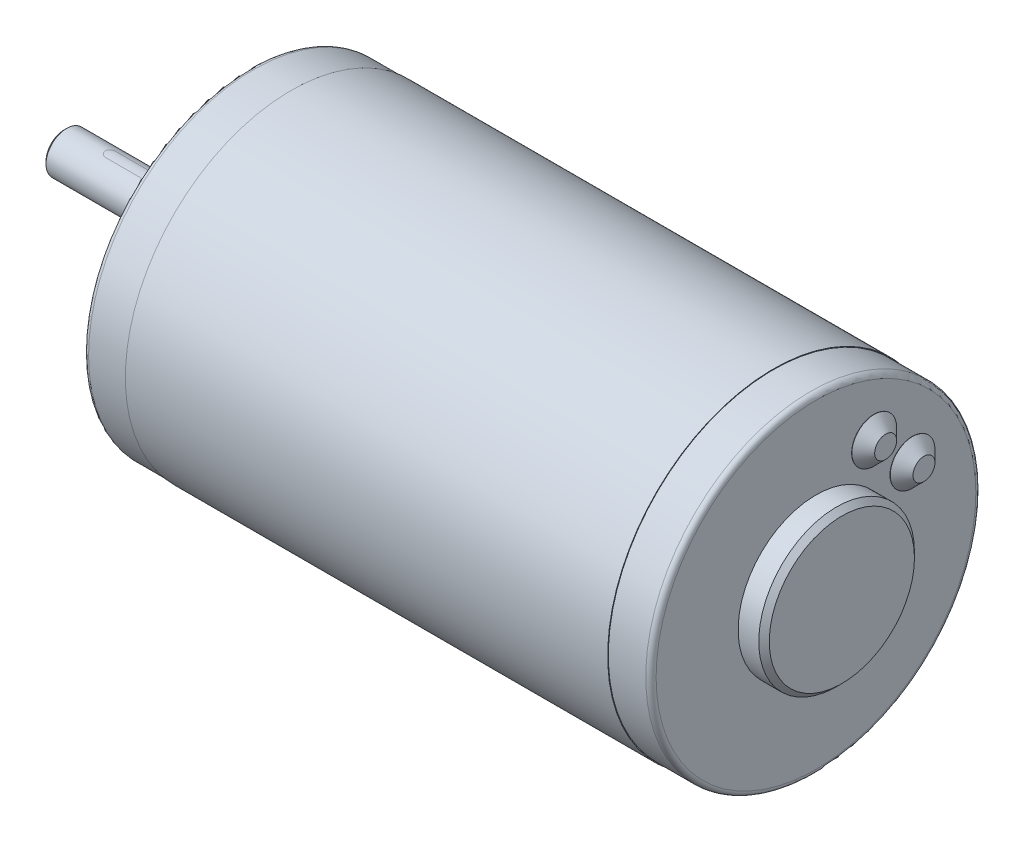
ISO-10303-21;
HEADER;
FILE_DESCRIPTION(('STEP AP214'),'2;1');
FILE_NAME('part.step','',(''),(''),'','','');
FILE_SCHEMA(('AUTOMOTIVE_DESIGN { 1 0 10303 214 1 1 1 1 }'));
ENDSEC;
DATA;
#1=APPLICATION_CONTEXT('core data for automotive mechanical design processes');
#2=APPLICATION_PROTOCOL_DEFINITION('international standard','automotive_design',2000,#1);
#3=PRODUCT_CONTEXT('',#1,'mechanical');
#4=PRODUCT('Part','Part','',(#3));
#5=PRODUCT_RELATED_PRODUCT_CATEGORY('part','',(#4));
#6=PRODUCT_DEFINITION_FORMATION('','',#4);
#7=PRODUCT_DEFINITION_CONTEXT('part definition',#1,'design');
#8=PRODUCT_DEFINITION('design','',#6,#7);
#9=PRODUCT_DEFINITION_SHAPE('','',#8);
#10=(LENGTH_UNIT() NAMED_UNIT(*) SI_UNIT(.MILLI.,.METRE.));
#11=(NAMED_UNIT(*) PLANE_ANGLE_UNIT() SI_UNIT($,.RADIAN.));
#12=(NAMED_UNIT(*) SI_UNIT($,.STERADIAN.) SOLID_ANGLE_UNIT());
#13=UNCERTAINTY_MEASURE_WITH_UNIT(LENGTH_MEASURE(1.E-05),#10,'distance_accuracy_value','');
#14=(GEOMETRIC_REPRESENTATION_CONTEXT(3) GLOBAL_UNCERTAINTY_ASSIGNED_CONTEXT((#13)) GLOBAL_UNIT_ASSIGNED_CONTEXT((#10,
#11,#12)) REPRESENTATION_CONTEXT('',''));
#15=CARTESIAN_POINT('',(0.,0.,0.));
#16=DIRECTION('',(0.,0.,1.));
#17=DIRECTION('',(1.,0.,0.));
#18=AXIS2_PLACEMENT_3D('',#15,#16,#17);
#19=CARTESIAN_POINT('',(-3.999992,0.,0.));
#20=DIRECTION('',(-1.,0.,0.));
#21=DIRECTION('',(0.,0.,1.));
#22=AXIS2_PLACEMENT_3D('',#19,#20,#21);
#23=PLANE('',#22);
#24=CARTESIAN_POINT('',(-3.999992,0.,0.));
#25=DIRECTION('',(-1.,0.,0.));
#26=DIRECTION('',(0.,0.,1.));
#27=AXIS2_PLACEMENT_3D('',#24,#25,#26);
#28=CIRCLE('',#27,8.50899999999999);
#29=CARTESIAN_POINT('',(-3.999992,0.,8.50899999999999));
#30=VERTEX_POINT('',#29);
#31=EDGE_CURVE('P0_E228',#30,#30,#28,.T.);
#32=ORIENTED_EDGE('',*,*,#31,.T.);
#33=EDGE_LOOP('',(#32));
#34=FACE_BOUND('',#33,.T.);
#35=CARTESIAN_POINT('',(-3.999992,0.,0.));
#36=DIRECTION('',(-1.,0.,0.));
#37=DIRECTION('',(0.,0.,1.));
#38=AXIS2_PLACEMENT_3D('',#35,#36,#37);
#39=CIRCLE('',#38,4.);
#40=CARTESIAN_POINT('',(-3.999992,0.,4.));
#41=VERTEX_POINT('',#40);
#42=EDGE_CURVE('P0_E137',#41,#41,#39,.T.);
#43=ORIENTED_EDGE('',*,*,#42,.F.);
#44=EDGE_LOOP('',(#43));
#45=FACE_BOUND('',#44,.T.);
#46=ADVANCED_FACE('P0_F42',(#34,#45),#23,.T.);
#47=CARTESIAN_POINT('',(0.,0.,0.));
#48=DIRECTION('',(-1.,0.,0.));
#49=DIRECTION('',(0.,0.,1.));
#50=AXIS2_PLACEMENT_3D('',#47,#48,#49);
#51=PLANE('',#50);
#52=CARTESIAN_POINT('',(0.,0.,0.));
#53=DIRECTION('',(-1.,0.,0.));
#54=DIRECTION('',(0.,0.,1.));
#55=AXIS2_PLACEMENT_3D('',#52,#53,#54);
#56=CIRCLE('',#55,30.877);
#57=CARTESIAN_POINT('',(0.,0.,30.877));
#58=VERTEX_POINT('',#57);
#59=EDGE_CURVE('P0_E51',#58,#58,#56,.T.);
#60=ORIENTED_EDGE('',*,*,#59,.T.);
#61=EDGE_LOOP('',(#60));
#62=FACE_BOUND('',#61,.T.);
#63=CARTESIAN_POINT('',(0.,25.4,0.));
#64=DIRECTION('',(-1.,0.,0.));
#65=DIRECTION('',(0.,0.,1.));
#66=AXIS2_PLACEMENT_3D('',#63,#64,#65);
#67=CIRCLE('',#66,2.01929999999999);
#68=CARTESIAN_POINT('',(0.,25.4,2.01929999999999));
#69=VERTEX_POINT('',#68);
#70=EDGE_CURVE('P0_E101',#69,#69,#67,.T.);
#71=ORIENTED_EDGE('',*,*,#70,.F.);
#72=EDGE_LOOP('',(#71));
#73=FACE_BOUND('',#72,.T.);
#74=CARTESIAN_POINT('',(0.,-25.4,0.));
#75=DIRECTION('',(-1.,0.,0.));
#76=DIRECTION('',(0.,0.,1.));
#77=AXIS2_PLACEMENT_3D('',#74,#75,#76);
#78=CIRCLE('',#77,2.01929999999999);
#79=CARTESIAN_POINT('',(0.,-25.4,2.01929999999999));
#80=VERTEX_POINT('',#79);
#81=EDGE_CURVE('P0_E100',#80,#80,#78,.T.);
#82=ORIENTED_EDGE('',*,*,#81,.F.);
#83=EDGE_LOOP('',(#82));
#84=FACE_BOUND('',#83,.T.);
#85=CARTESIAN_POINT('',(0.,0.,0.));
#86=DIRECTION('',(-1.,0.,0.));
#87=DIRECTION('',(0.,0.,1.));
#88=AXIS2_PLACEMENT_3D('',#85,#86,#87);
#89=CIRCLE('',#88,9.525);
#90=CARTESIAN_POINT('',(0.,0.,9.525));
#91=VERTEX_POINT('',#90);
#92=EDGE_CURVE('P0_E189',#91,#91,#89,.T.);
#93=ORIENTED_EDGE('',*,*,#92,.F.);
#94=EDGE_LOOP('',(#93));
#95=FACE_BOUND('',#94,.T.);
#96=ADVANCED_FACE('P0_F254',(#62,#73,#84,#95),#51,.T.);
#97=CARTESIAN_POINT('',(8.2296,32.004,0.));
#98=DIRECTION('',(-1.,0.,0.));
#99=DIRECTION('',(0.,0.,1.));
#100=AXIS2_PLACEMENT_3D('',#97,#98,#99);
#101=PLANE('',#100);
#102=CARTESIAN_POINT('',(8.2296,0.,0.));
#103=DIRECTION('',(1.,0.,0.));
#104=DIRECTION('',(0.,0.,-1.));
#105=AXIS2_PLACEMENT_3D('',#102,#103,#104);
#106=CIRCLE('',#105,32.004);
#107=CARTESIAN_POINT('',(8.2296,0.,-32.004));
#108=VERTEX_POINT('',#107);
#109=EDGE_CURVE('P0_E217',#108,#108,#106,.T.);
#110=ORIENTED_EDGE('',*,*,#109,.F.);
#111=EDGE_LOOP('',(#110));
#112=FACE_BOUND('',#111,.T.);
#113=CARTESIAN_POINT('',(8.2296,0.,0.));
#114=DIRECTION('',(-1.,0.,0.));
#115=DIRECTION('',(0.,0.,1.));
#116=AXIS2_PLACEMENT_3D('',#113,#114,#115);
#117=CIRCLE('',#116,31.877);
#118=CARTESIAN_POINT('',(8.2296,0.,31.877));
#119=VERTEX_POINT('',#118);
#120=EDGE_CURVE('P0_E193',#119,#119,#117,.T.);
#121=ORIENTED_EDGE('',*,*,#120,.F.);
#122=EDGE_LOOP('',(#121));
#123=FACE_BOUND('',#122,.T.);
#124=ADVANCED_FACE('P0_F272',(#112,#123),#101,.T.);
#125=CARTESIAN_POINT('',(109.6,0.,0.));
#126=DIRECTION('',(1.,0.,0.));
#127=DIRECTION('',(0.,0.,-1.));
#128=AXIS2_PLACEMENT_3D('',#125,#126,#127);
#129=PLANE('',#128);
#130=CARTESIAN_POINT('',(109.6,0.,0.));
#131=DIRECTION('',(1.,0.,0.));
#132=DIRECTION('',(0.,0.,-1.));
#133=AXIS2_PLACEMENT_3D('',#130,#131,#132);
#134=CIRCLE('',#133,30.877);
#135=CARTESIAN_POINT('',(109.6,0.,-30.877));
#136=VERTEX_POINT('',#135);
#137=EDGE_CURVE('P0_E243',#136,#136,#134,.T.);
#138=ORIENTED_EDGE('',*,*,#137,.T.);
#139=EDGE_LOOP('',(#138));
#140=FACE_BOUND('',#139,.T.);
#141=CARTESIAN_POINT('',(109.6,18.6070906828553,-11.2073596390943));
#142=DIRECTION('',(1.,0.,0.));
#143=DIRECTION('',(0.,0.,-1.));
#144=AXIS2_PLACEMENT_3D('',#141,#142,#143);
#145=CIRCLE('',#144,4.318);
#146=CARTESIAN_POINT('',(109.6,18.6070906828553,-15.5253596390943));
#147=VERTEX_POINT('',#146);
#148=EDGE_CURVE('P0_E225',#147,#147,#145,.T.);
#149=ORIENTED_EDGE('',*,*,#148,.F.);
#150=EDGE_LOOP('',(#149));
#151=FACE_BOUND('',#150,.T.);
#152=CARTESIAN_POINT('',(109.6,11.2073596390943,-18.6070906828553));
#153=DIRECTION('',(1.,0.,0.));
#154=DIRECTION('',(0.,0.,-1.));
#155=AXIS2_PLACEMENT_3D('',#152,#153,#154);
#156=CIRCLE('',#155,4.318);
#157=CARTESIAN_POINT('',(109.6,11.2073596390943,-22.9250906828553));
#158=VERTEX_POINT('',#157);
#159=EDGE_CURVE('P0_E221',#158,#158,#156,.T.);
#160=ORIENTED_EDGE('',*,*,#159,.F.);
#161=EDGE_LOOP('',(#160));
#162=FACE_BOUND('',#161,.T.);
#163=CARTESIAN_POINT('',(109.6,0.,0.));
#164=DIRECTION('',(1.,0.,0.));
#165=DIRECTION('',(0.,0.,-1.));
#166=AXIS2_PLACEMENT_3D('',#163,#164,#165);
#167=CIRCLE('',#166,15.0368);
#168=CARTESIAN_POINT('',(109.6,0.,-15.0368));
#169=VERTEX_POINT('',#168);
#170=EDGE_CURVE('P0_E201',#169,#169,#167,.T.);
#171=ORIENTED_EDGE('',*,*,#170,.F.);
#172=EDGE_LOOP('',(#171));
#173=FACE_BOUND('',#172,.T.);
#174=ADVANCED_FACE('P0_F300',(#140,#151,#162,#173),#129,.T.);
#175=CARTESIAN_POINT('',(101.3704,0.,0.));
#176=DIRECTION('',(1.,0.,0.));
#177=DIRECTION('',(0.,0.,-1.));
#178=AXIS2_PLACEMENT_3D('',#175,#176,#177);
#179=PLANE('',#178);
#180=CARTESIAN_POINT('',(101.3704,0.,0.));
#181=DIRECTION('',(1.,0.,0.));
#182=DIRECTION('',(0.,0.,-1.));
#183=AXIS2_PLACEMENT_3D('',#180,#181,#182);
#184=CIRCLE('',#183,32.004);
#185=CARTESIAN_POINT('',(101.3704,0.,-32.004));
#186=VERTEX_POINT('',#185);
#187=EDGE_CURVE('P0_E213',#186,#186,#184,.T.);
#188=ORIENTED_EDGE('',*,*,#187,.T.);
#189=EDGE_LOOP('',(#188));
#190=FACE_BOUND('',#189,.T.);
#191=CARTESIAN_POINT('',(101.3704,0.,0.));
#192=DIRECTION('',(1.,0.,0.));
#193=DIRECTION('',(0.,0.,-1.));
#194=AXIS2_PLACEMENT_3D('',#191,#192,#193);
#195=CIRCLE('',#194,31.877);
#196=CARTESIAN_POINT('',(101.3704,0.,-31.877));
#197=VERTEX_POINT('',#196);
#198=EDGE_CURVE('P0_E206',#197,#197,#195,.T.);
#199=ORIENTED_EDGE('',*,*,#198,.F.);
#200=EDGE_LOOP('',(#199));
#201=FACE_BOUND('',#200,.T.);
#202=ADVANCED_FACE('P0_F303',(#190,#201),#179,.T.);
#203=CARTESIAN_POINT('',(8.2296,0.,0.));
#204=DIRECTION('',(1.,0.,0.));
#205=DIRECTION('',(0.,0.,-1.));
#206=AXIS2_PLACEMENT_3D('',#203,#204,#205);
#207=CYLINDRICAL_SURFACE('',#206,32.004);
#208=ORIENTED_EDGE('',*,*,#109,.T.);
#209=EDGE_LOOP('',(#208));
#210=FACE_BOUND('',#209,.T.);
#211=ORIENTED_EDGE('',*,*,#187,.F.);
#212=EDGE_LOOP('',(#211));
#213=FACE_BOUND('',#212,.T.);
#214=ADVANCED_FACE('P0_F307',(#210,#213),#207,.T.);
#215=CARTESIAN_POINT('',(109.6,0.,0.));
#216=DIRECTION('',(-1.,0.,0.));
#217=DIRECTION('',(0.,0.,1.));
#218=AXIS2_PLACEMENT_3D('',#215,#216,#217);
#219=CYLINDRICAL_SURFACE('',#218,31.877);
#220=CARTESIAN_POINT('',(108.6,0.,0.));
#221=DIRECTION('',(1.,0.,0.));
#222=DIRECTION('',(0.,0.,-1.));
#223=AXIS2_PLACEMENT_3D('',#220,#221,#222);
#224=CIRCLE('',#223,31.877);
#225=CARTESIAN_POINT('',(108.6,0.,-31.877));
#226=VERTEX_POINT('',#225);
#227=EDGE_CURVE('P0_E247',#226,#226,#224,.F.);
#228=ORIENTED_EDGE('',*,*,#227,.T.);
#229=EDGE_LOOP('',(#228));
#230=FACE_BOUND('',#229,.T.);
#231=ORIENTED_EDGE('',*,*,#198,.T.);
#232=EDGE_LOOP('',(#231));
#233=FACE_BOUND('',#232,.T.);
#234=ADVANCED_FACE('P0_F298',(#230,#233),#219,.T.);
#235=CARTESIAN_POINT('',(113.584,0.,0.));
#236=DIRECTION('',(-1.,0.,0.));
#237=DIRECTION('',(0.,0.,1.));
#238=AXIS2_PLACEMENT_3D('',#235,#236,#237);
#239=CYLINDRICAL_SURFACE('',#238,15.0368);
#240=CARTESIAN_POINT('',(113.584,0.,0.));
#241=DIRECTION('',(1.,0.,0.));
#242=DIRECTION('',(0.,0.,-1.));
#243=AXIS2_PLACEMENT_3D('',#240,#241,#242);
#244=CIRCLE('',#243,15.0368);
#245=CARTESIAN_POINT('',(113.584,0.,-15.0368));
#246=VERTEX_POINT('',#245);
#247=EDGE_CURVE('P0_E202',#246,#246,#244,.T.);
#248=ORIENTED_EDGE('',*,*,#247,.F.);
#249=EDGE_LOOP('',(#248));
#250=FACE_BOUND('',#249,.T.);
#251=ORIENTED_EDGE('',*,*,#170,.T.);
#252=EDGE_LOOP('',(#251));
#253=FACE_BOUND('',#252,.T.);
#254=ADVANCED_FACE('P0_F294',(#250,#253),#239,.T.);
#255=CARTESIAN_POINT('',(113.584,0.,0.));
#256=DIRECTION('',(-1.,0.,0.));
#257=DIRECTION('',(0.,0.,-1.));
#258=AXIS2_PLACEMENT_3D('',#255,#256,#257);
#259=CONICAL_SURFACE('',#258,15.0368,0.785398163397437);
#260=CARTESIAN_POINT('',(114.6,0.,0.));
#261=DIRECTION('',(1.,0.,0.));
#262=DIRECTION('',(0.,0.,-1.));
#263=AXIS2_PLACEMENT_3D('',#260,#261,#262);
#264=CIRCLE('',#263,14.0208);
#265=CARTESIAN_POINT('',(114.6,0.,-14.0208));
#266=VERTEX_POINT('',#265);
#267=EDGE_CURVE('P0_E197',#266,#266,#264,.T.);
#268=ORIENTED_EDGE('',*,*,#267,.F.);
#269=EDGE_LOOP('',(#268));
#270=FACE_BOUND('',#269,.T.);
#271=ORIENTED_EDGE('',*,*,#247,.T.);
#272=EDGE_LOOP('',(#271));
#273=FACE_BOUND('',#272,.T.);
#274=ADVANCED_FACE('P0_F290',(#270,#273),#259,.T.);
#275=CARTESIAN_POINT('',(114.6,0.,0.));
#276=DIRECTION('',(1.,0.,0.));
#277=DIRECTION('',(0.,0.,-1.));
#278=AXIS2_PLACEMENT_3D('',#275,#276,#277);
#279=PLANE('',#278);
#280=ORIENTED_EDGE('',*,*,#267,.T.);
#281=EDGE_LOOP('',(#280));
#282=FACE_BOUND('',#281,.T.);
#283=ADVANCED_FACE('P0_F286',(#282),#279,.T.);
#284=CARTESIAN_POINT('',(0.,0.,0.));
#285=DIRECTION('',(1.,0.,0.));
#286=DIRECTION('',(0.,0.,-1.));
#287=AXIS2_PLACEMENT_3D('',#284,#285,#286);
#288=CYLINDRICAL_SURFACE('',#287,31.877);
#289=CARTESIAN_POINT('',(0.999999999999998,0.,0.));
#290=DIRECTION('',(-1.,0.,0.));
#291=DIRECTION('',(0.,0.,1.));
#292=AXIS2_PLACEMENT_3D('',#289,#290,#291);
#293=CIRCLE('',#292,31.877);
#294=CARTESIAN_POINT('',(0.999999999999998,0.,31.877));
#295=VERTEX_POINT('',#294);
#296=EDGE_CURVE('P0_E11',#295,#295,#293,.F.);
#297=ORIENTED_EDGE('',*,*,#296,.T.);
#298=EDGE_LOOP('',(#297));
#299=FACE_BOUND('',#298,.T.);
#300=ORIENTED_EDGE('',*,*,#120,.T.);
#301=EDGE_LOOP('',(#300));
#302=FACE_BOUND('',#301,.T.);
#303=ADVANCED_FACE('P0_F281',(#299,#302),#288,.T.);
#304=CARTESIAN_POINT('',(-3.999992,0.,0.));
#305=DIRECTION('',(1.,0.,0.));
#306=DIRECTION('',(0.,0.,-1.));
#307=AXIS2_PLACEMENT_3D('',#304,#305,#306);
#308=CYLINDRICAL_SURFACE('',#307,9.525);
#309=CARTESIAN_POINT('',(-2.983992,0.,0.));
#310=DIRECTION('',(-1.,0.,0.));
#311=DIRECTION('',(0.,0.,1.));
#312=AXIS2_PLACEMENT_3D('',#309,#310,#311);
#313=CIRCLE('',#312,9.525);
#314=CARTESIAN_POINT('',(-2.983992,0.,9.525));
#315=VERTEX_POINT('',#314);
#316=EDGE_CURVE('P0_E232',#315,#315,#313,.F.);
#317=ORIENTED_EDGE('',*,*,#316,.T.);
#318=EDGE_LOOP('',(#317));
#319=FACE_BOUND('',#318,.T.);
#320=ORIENTED_EDGE('',*,*,#92,.T.);
#321=EDGE_LOOP('',(#320));
#322=FACE_BOUND('',#321,.T.);
#323=ADVANCED_FACE('P0_F279',(#319,#322),#308,.T.);
#324=CARTESIAN_POINT('',(-35.599992,0.,0.));
#325=DIRECTION('',(1.,0.,0.));
#326=DIRECTION('',(0.,0.,-1.));
#327=AXIS2_PLACEMENT_3D('',#324,#325,#326);
#328=CYLINDRICAL_SURFACE('',#327,4.);
#329=CARTESIAN_POINT('',(-35.099991999993,0.,0.));
#330=DIRECTION('',(-1.,0.,0.));
#331=DIRECTION('',(0.,0.,1.));
#332=AXIS2_PLACEMENT_3D('',#329,#330,#331);
#333=CIRCLE('',#332,4.);
#334=CARTESIAN_POINT('',(-35.099991999993,0.,4.));
#335=VERTEX_POINT('',#334);
#336=EDGE_CURVE('P0_E239',#335,#335,#333,.F.);
#337=ORIENTED_EDGE('',*,*,#336,.T.);
#338=EDGE_LOOP('',(#337));
#339=FACE_BOUND('',#338,.T.);
#340=DIRECTION('',(1.,0.,0.));
#341=VECTOR('',#340,1.);
#342=CARTESIAN_POINT('',(0.,3.87298334620741,-1.));
#343=LINE('',#342,#341);
#344=CARTESIAN_POINT('',(-26.6,3.87298334620741,-1.));
#345=VERTEX_POINT('',#344);
#346=CARTESIAN_POINT('',(-7.1,3.87298334620741,-1.));
#347=VERTEX_POINT('',#346);
#348=EDGE_CURVE('P0_E159',#345,#347,#343,.T.);
#349=ORIENTED_EDGE('',*,*,#348,.T.);
#350=CARTESIAN_POINT('',(-7.1,3.87298334620741,-1.));
#351=CARTESIAN_POINT('',(-7.07233701489346,3.87298148580177,-1.00000033749611));
#352=CARTESIAN_POINT('',(-7.04468773698177,3.8732800994947,-0.998851407375366));
#353=CARTESIAN_POINT('',(-6.98959596469644,3.87445904774558,-0.994271295395754));
#354=CARTESIAN_POINT('',(-6.96215343631291,3.87533928441687,-0.990840497572679));
#355=CARTESIAN_POINT('',(-6.88054682679116,3.87881710972053,-0.977175239382526));
#356=CARTESIAN_POINT('',(-6.82694353151779,3.88225203148808,-0.963567695172493));
#357=CARTESIAN_POINT('',(-6.72287532621804,3.89095422588002,-0.927798076247997));
#358=CARTESIAN_POINT('',(-6.67241012178714,3.89622132630929,-0.905636805423836));
#359=CARTESIAN_POINT('',(-6.57588855135267,3.90799134471939,-0.853415378025865));
#360=CARTESIAN_POINT('',(-6.52983337210904,3.91449459395647,-0.823353103356933));
#361=CARTESIAN_POINT('',(-6.4424561180939,3.92816262398025,-0.755484471828069));
#362=CARTESIAN_POINT('',(-6.40124511375448,3.93533791028915,-0.717537268783976));
#363=CARTESIAN_POINT('',(-6.32569791051729,3.94945104396193,-0.63527578051623));
#364=CARTESIAN_POINT('',(-6.29136281053206,3.95638885322537,-0.590960479478831));
#365=CARTESIAN_POINT('',(-6.23008899838136,3.96936182283248,-0.496456899401691));
#366=CARTESIAN_POINT('',(-6.20326010401603,3.9753830468173,-0.446195340334474));
#367=CARTESIAN_POINT('',(-6.1584752658033,3.98572346250588,-0.341702590842919));
#368=CARTESIAN_POINT('',(-6.14051757570017,3.990042989147,-0.28747218408301));
#369=CARTESIAN_POINT('',(-6.11434100722257,3.99641900005128,-0.17774410852516));
#370=CARTESIAN_POINT('',(-6.10593232757718,3.998519529013,-0.122294322002858));
#371=CARTESIAN_POINT('',(-6.09849662845671,4.00037438150815,-0.0107327756816796));
#372=CARTESIAN_POINT('',(-6.09946842980766,4.00012899993444,0.0453789000287057));
#373=CARTESIAN_POINT('',(-6.11062996368545,3.99735237365735,0.155352492972096));
#374=CARTESIAN_POINT('',(-6.12061461659948,3.9948719867736,0.209236701739855));
#375=CARTESIAN_POINT('',(-6.14918867918275,3.98796330636495,0.31453871108434));
#376=CARTESIAN_POINT('',(-6.16777846956858,3.98353492665556,0.365956402423988));
#377=CARTESIAN_POINT('',(-6.21320128067065,3.97314997761798,0.465407286024539));
#378=CARTESIAN_POINT('',(-6.24010739423284,3.96717993827555,0.513405629602248));
#379=CARTESIAN_POINT('',(-6.30134312983347,3.95435945541919,0.604276631230014));
#380=CARTESIAN_POINT('',(-6.33567387025322,3.94750887933198,0.647148515562289));
#381=CARTESIAN_POINT('',(-6.41187891208131,3.93345566022865,0.72776938970849));
#382=CARTESIAN_POINT('',(-6.45393163653981,3.92624850477685,0.765349103054127));
#383=CARTESIAN_POINT('',(-6.54382986692773,3.91246168284006,0.832969575186237));
#384=CARTESIAN_POINT('',(-6.59167695328356,3.90588218842993,0.863008270245062));
#385=CARTESIAN_POINT('',(-6.69214559782377,3.89407813586325,0.914804709285962));
#386=CARTESIAN_POINT('',(-6.74479146489609,3.88886106009136,0.936517017887269));
#387=CARTESIAN_POINT('',(-6.85311692841829,3.88047058807055,0.970702351849829));
#388=CARTESIAN_POINT('',(-6.90879185514984,3.87729413761435,0.983189189212132));
#389=CARTESIAN_POINT('',(-6.9874573807589,3.87455290681524,0.993904635150938));
#390=CARTESIAN_POINT('',(-7.00991970321318,3.87396523110859,0.996190790966708));
#391=CARTESIAN_POINT('',(-7.05491778990932,3.87318062488974,0.999236757697394));
#392=CARTESIAN_POINT('',(-7.07745337595529,3.87298306219461,0.999999038096045));
#393=CARTESIAN_POINT('',(-7.1,3.87298334620741,1.));
#394=B_SPLINE_CURVE_WITH_KNOTS('',3,(#350,#351,#352,#353,#354,#355,#356,#357,#358,#359,#360,
#361,#362,#363,#364,#365,#366,#367,#368,#369,#370,#371,#372,#373,#374,#375,#376,#377,#378,#379,
#380,#381,#382,#383,#384,#385,#386,#387,#388,#389,#390,#391,#392,#393),.UNSPECIFIED.,.F.,.F.,(4,
2,2,2,2,2,2,2,2,2,2,2,2,2,2,2,2,2,2,2,2,4),(0.,0.0829365303397693,0.165859106084651,
0.331229963080317,0.496585282091498,0.661984974726749,0.830641897427974,0.999325753539193,
1.17036187098235,1.34136430732424,1.50890481515325,1.67642426256639,1.84022545479276,
2.00403389475838,2.16932509450376,2.33464120964329,2.50441429534542,2.67423379180967,
2.84496720161068,3.01544447539986,3.08315848722648,3.15076267731671),.UNSPECIFIED.);
#395=CARTESIAN_POINT('',(-7.1,3.87298334620741,1.));
#396=VERTEX_POINT('',#395);
#397=EDGE_CURVE('P0_E132',#347,#396,#394,.T.);
#398=ORIENTED_EDGE('',*,*,#397,.T.);
#399=DIRECTION('',(1.,0.,0.));
#400=VECTOR('',#399,1.);
#401=CARTESIAN_POINT('',(0.,3.87298334620741,1.));
#402=LINE('',#401,#400);
#403=CARTESIAN_POINT('',(-26.6,3.87298334620741,1.));
#404=VERTEX_POINT('',#403);
#405=EDGE_CURVE('P0_E174',#396,#404,#402,.F.);
#406=ORIENTED_EDGE('',*,*,#405,.T.);
#407=CARTESIAN_POINT('',(-26.6,3.87298334620741,1.));
#408=CARTESIAN_POINT('',(-26.6276629851065,3.87298148580177,1.00000033749611));
#409=CARTESIAN_POINT('',(-26.6553122630182,3.8732800994947,0.998851407375366));
#410=CARTESIAN_POINT('',(-26.7104040353036,3.87445904774558,0.994271295395754));
#411=CARTESIAN_POINT('',(-26.7378465636871,3.87533928441687,0.990840497572679));
#412=CARTESIAN_POINT('',(-26.8194531732088,3.87881710972053,0.977175239382526));
#413=CARTESIAN_POINT('',(-26.8730564684822,3.88225203148808,0.963567695172493));
#414=CARTESIAN_POINT('',(-26.977124673782,3.89095422588002,0.927798076247996));
#415=CARTESIAN_POINT('',(-27.0275898782129,3.89622132630929,0.905636805423835));
#416=CARTESIAN_POINT('',(-27.1241114486473,3.90799134471939,0.853415378025864));
#417=CARTESIAN_POINT('',(-27.170166627891,3.91449459395647,0.823353103356932));
#418=CARTESIAN_POINT('',(-27.2575438819061,3.92816262398025,0.755484471828069));
#419=CARTESIAN_POINT('',(-27.2987548862455,3.93533791028915,0.717537268783975));
#420=CARTESIAN_POINT('',(-27.3743020894827,3.94945104396193,0.635275780516229));
#421=CARTESIAN_POINT('',(-27.4086371894679,3.95638885322537,0.59096047947883));
#422=CARTESIAN_POINT('',(-27.4699110016186,3.96936182283248,0.496456899401689));
#423=CARTESIAN_POINT('',(-27.496739895984,3.9753830468173,0.446195340334472));
#424=CARTESIAN_POINT('',(-27.5415247341967,3.98572346250588,0.341702590842916));
#425=CARTESIAN_POINT('',(-27.5594824242998,3.990042989147,0.287472184083007));
#426=CARTESIAN_POINT('',(-27.5856589927774,3.99641900005128,0.177744108525158));
#427=CARTESIAN_POINT('',(-27.5940676724228,3.998519529013,0.122294322002856));
#428=CARTESIAN_POINT('',(-27.6015033715433,4.00037438150815,0.0107327756816781));
#429=CARTESIAN_POINT('',(-27.6005315701923,4.00012899993444,-0.0453789000287067));
#430=CARTESIAN_POINT('',(-27.5893700363146,3.99735237365735,-0.155352492972096));
#431=CARTESIAN_POINT('',(-27.5793853834005,3.9948719867736,-0.209236701739855));
#432=CARTESIAN_POINT('',(-27.5508113208173,3.98796330636495,-0.31453871108434));
#433=CARTESIAN_POINT('',(-27.5322215304314,3.98353492665556,-0.365956402423988));
#434=CARTESIAN_POINT('',(-27.4867987193294,3.97314997761798,-0.46540728602454));
#435=CARTESIAN_POINT('',(-27.4598926057672,3.96717993827555,-0.513405629602248));
#436=CARTESIAN_POINT('',(-27.3986568701665,3.95435945541919,-0.604276631230015));
#437=CARTESIAN_POINT('',(-27.3643261297468,3.94750887933198,-0.64714851556229));
#438=CARTESIAN_POINT('',(-27.2881210879187,3.93345566022865,-0.727769389708492));
#439=CARTESIAN_POINT('',(-27.2460683634602,3.92624850477685,-0.765349103054128));
#440=CARTESIAN_POINT('',(-27.1561701330723,3.91246168284006,-0.832969575186237));
#441=CARTESIAN_POINT('',(-27.1083230467164,3.90588218842993,-0.863008270245062));
#442=CARTESIAN_POINT('',(-27.0078544021762,3.89407813586325,-0.914804709285961));
#443=CARTESIAN_POINT('',(-26.9552085351039,3.88886106009136,-0.936517017887269));
#444=CARTESIAN_POINT('',(-26.8468830715817,3.88047058807054,-0.970702351849828));
#445=CARTESIAN_POINT('',(-26.7912081448502,3.87729413761435,-0.983189189212131));
#446=CARTESIAN_POINT('',(-26.7125426192411,3.87455290681524,-0.993904635150938));
#447=CARTESIAN_POINT('',(-26.6900802967868,3.87396523110859,-0.996190790966708));
#448=CARTESIAN_POINT('',(-26.6450822100907,3.87318062488974,-0.999236757697394));
#449=CARTESIAN_POINT('',(-26.6225466240447,3.87298306219461,-0.999999038096045));
#450=CARTESIAN_POINT('',(-26.6,3.87298334620741,-1.));
#451=B_SPLINE_CURVE_WITH_KNOTS('',3,(#407,#408,#409,#410,#411,#412,#413,#414,#415,#416,#417,
#418,#419,#420,#421,#422,#423,#424,#425,#426,#427,#428,#429,#430,#431,#432,#433,#434,#435,#436,
#437,#438,#439,#440,#441,#442,#443,#444,#445,#446,#447,#448,#449,#450),.UNSPECIFIED.,.F.,.F.,(4,
2,2,2,2,2,2,2,2,2,2,2,2,2,2,2,2,2,2,2,2,4),(0.,0.0829365303397727,0.165859106084653,
0.331229963080318,0.496585282091499,0.661984974726751,0.830641897427976,0.999325753539196,
1.17036187098235,1.34136430732425,1.50890481515325,1.67642426256639,1.84022545479276,
2.00403389475838,2.16932509450376,2.33464120964329,2.50441429534542,2.67423379180967,
2.84496720161068,3.01544447539986,3.08315848722649,3.15076267731671),.UNSPECIFIED.);
#452=EDGE_CURVE('P0_E58',#404,#345,#451,.T.);
#453=ORIENTED_EDGE('',*,*,#452,.T.);
#454=EDGE_LOOP('',(#349,#398,#406,#453));
#455=FACE_BOUND('',#454,.T.);
#456=ORIENTED_EDGE('',*,*,#42,.T.);
#457=EDGE_LOOP('',(#456));
#458=FACE_BOUND('',#457,.T.);
#459=ADVANCED_FACE('P0_F277',(#339,#455,#458),#328,.T.);
#460=CARTESIAN_POINT('',(-35.599992,0.,0.));
#461=DIRECTION('',(-1.,0.,0.));
#462=DIRECTION('',(0.,0.,1.));
#463=AXIS2_PLACEMENT_3D('',#460,#461,#462);
#464=PLANE('',#463);
#465=CARTESIAN_POINT('',(-35.599992,0.,0.));
#466=DIRECTION('',(-1.,0.,0.));
#467=DIRECTION('',(0.,0.,1.));
#468=AXIS2_PLACEMENT_3D('',#465,#466,#467);
#469=CIRCLE('',#468,3.49999999993612);
#470=CARTESIAN_POINT('',(-35.599992,0.,3.49999999993612));
#471=VERTEX_POINT('',#470);
#472=EDGE_CURVE('P0_E236',#471,#471,#469,.T.);
#473=ORIENTED_EDGE('',*,*,#472,.T.);
#474=EDGE_LOOP('',(#473));
#475=FACE_BOUND('',#474,.T.);
#476=ADVANCED_FACE('P0_F330',(#475),#464,.T.);
#477=CARTESIAN_POINT('',(-7.1,32.005,0.));
#478=DIRECTION('',(0.,-1.,0.));
#479=DIRECTION('',(0.,0.,-1.));
#480=AXIS2_PLACEMENT_3D('',#477,#478,#479);
#481=CYLINDRICAL_SURFACE('',#480,1.);
#482=ORIENTED_EDGE('',*,*,#397,.F.);
#483=DIRECTION('',(0.,-1.,0.));
#484=VECTOR('',#483,1.);
#485=CARTESIAN_POINT('',(-7.1,32.005,-1.));
#486=LINE('',#485,#484);
#487=CARTESIAN_POINT('',(-7.1,2.79999999999999,-1.));
#488=VERTEX_POINT('',#487);
#489=EDGE_CURVE('P0_E158',#347,#488,#486,.T.);
#490=ORIENTED_EDGE('',*,*,#489,.T.);
#491=CARTESIAN_POINT('',(-7.1,2.79999999999999,0.));
#492=DIRECTION('',(0.,-1.,0.));
#493=DIRECTION('',(0.,0.,-1.));
#494=AXIS2_PLACEMENT_3D('',#491,#492,#493);
#495=CIRCLE('',#494,1.);
#496=CARTESIAN_POINT('',(-7.1,2.79999999999999,1.));
#497=VERTEX_POINT('',#496);
#498=EDGE_CURVE('P0_E146',#488,#497,#495,.T.);
#499=ORIENTED_EDGE('',*,*,#498,.T.);
#500=DIRECTION('',(0.,-1.,0.));
#501=VECTOR('',#500,1.);
#502=CARTESIAN_POINT('',(-7.1,32.005,1.));
#503=LINE('',#502,#501);
#504=EDGE_CURVE('P0_E66',#396,#497,#503,.T.);
#505=ORIENTED_EDGE('',*,*,#504,.F.);
#506=EDGE_LOOP('',(#482,#490,#499,#505));
#507=FACE_BOUND('',#506,.T.);
#508=ADVANCED_FACE('P0_F332',(#507),#481,.F.);
#509=CARTESIAN_POINT('',(-26.6,32.005,-1.));
#510=DIRECTION('',(0.,0.,-1.));
#511=DIRECTION('',(-1.,0.,0.));
#512=AXIS2_PLACEMENT_3D('',#509,#510,#511);
#513=PLANE('',#512);
#514=ORIENTED_EDGE('',*,*,#348,.F.);
#515=DIRECTION('',(0.,-1.,0.));
#516=VECTOR('',#515,1.);
#517=CARTESIAN_POINT('',(-26.6,32.005,-1.));
#518=LINE('',#517,#516);
#519=CARTESIAN_POINT('',(-26.6,2.79999999999999,-1.));
#520=VERTEX_POINT('',#519);
#521=EDGE_CURVE('P0_E157',#345,#520,#518,.T.);
#522=ORIENTED_EDGE('',*,*,#521,.T.);
#523=DIRECTION('',(1.,0.,0.));
#524=VECTOR('',#523,1.);
#525=CARTESIAN_POINT('',(-26.6,2.79999999999999,-1.));
#526=LINE('',#525,#524);
#527=EDGE_CURVE('P0_E133',#520,#488,#526,.T.);
#528=ORIENTED_EDGE('',*,*,#527,.T.);
#529=ORIENTED_EDGE('',*,*,#489,.F.);
#530=EDGE_LOOP('',(#514,#522,#528,#529));
#531=FACE_BOUND('',#530,.T.);
#532=ADVANCED_FACE('P0_F337',(#531),#513,.F.);
#533=CARTESIAN_POINT('',(-26.6,32.005,0.));
#534=DIRECTION('',(0.,-1.,0.));
#535=DIRECTION('',(0.,0.,-1.));
#536=AXIS2_PLACEMENT_3D('',#533,#534,#535);
#537=CYLINDRICAL_SURFACE('',#536,1.);
#538=ORIENTED_EDGE('',*,*,#452,.F.);
#539=DIRECTION('',(0.,-1.,0.));
#540=VECTOR('',#539,1.);
#541=CARTESIAN_POINT('',(-26.6,32.005,1.));
#542=LINE('',#541,#540);
#543=CARTESIAN_POINT('',(-26.6,2.79999999999999,1.));
#544=VERTEX_POINT('',#543);
#545=EDGE_CURVE('P0_E149',#404,#544,#542,.T.);
#546=ORIENTED_EDGE('',*,*,#545,.T.);
#547=CARTESIAN_POINT('',(-26.6,2.79999999999999,0.));
#548=DIRECTION('',(0.,-1.,0.));
#549=DIRECTION('',(0.,0.,-1.));
#550=AXIS2_PLACEMENT_3D('',#547,#548,#549);
#551=CIRCLE('',#550,1.);
#552=EDGE_CURVE('P0_E138',#544,#520,#551,.T.);
#553=ORIENTED_EDGE('',*,*,#552,.T.);
#554=ORIENTED_EDGE('',*,*,#521,.F.);
#555=EDGE_LOOP('',(#538,#546,#553,#554));
#556=FACE_BOUND('',#555,.T.);
#557=ADVANCED_FACE('P0_F343',(#556),#537,.F.);
#558=CARTESIAN_POINT('',(-7.1,32.005,1.));
#559=DIRECTION('',(0.,0.,1.));
#560=DIRECTION('',(1.,0.,0.));
#561=AXIS2_PLACEMENT_3D('',#558,#559,#560);
#562=PLANE('',#561);
#563=ORIENTED_EDGE('',*,*,#405,.F.);
#564=ORIENTED_EDGE('',*,*,#504,.T.);
#565=DIRECTION('',(-1.,0.,0.));
#566=VECTOR('',#565,1.);
#567=CARTESIAN_POINT('',(-7.1,2.79999999999999,1.));
#568=LINE('',#567,#566);
#569=EDGE_CURVE('P0_E142',#497,#544,#568,.T.);
#570=ORIENTED_EDGE('',*,*,#569,.T.);
#571=ORIENTED_EDGE('',*,*,#545,.F.);
#572=EDGE_LOOP('',(#563,#564,#570,#571));
#573=FACE_BOUND('',#572,.T.);
#574=ADVANCED_FACE('P0_F346',(#573),#562,.F.);
#575=CARTESIAN_POINT('',(-7.1,2.79999999999999,0.));
#576=DIRECTION('',(0.,-1.,0.));
#577=DIRECTION('',(0.,0.,-1.));
#578=AXIS2_PLACEMENT_3D('',#575,#576,#577);
#579=PLANE('',#578);
#580=ORIENTED_EDGE('',*,*,#498,.F.);
#581=ORIENTED_EDGE('',*,*,#527,.F.);
#582=ORIENTED_EDGE('',*,*,#552,.F.);
#583=ORIENTED_EDGE('',*,*,#569,.F.);
#584=EDGE_LOOP('',(#580,#581,#582,#583));
#585=FACE_BOUND('',#584,.T.);
#586=ADVANCED_FACE('P0_F348',(#585),#579,.F.);
#587=CARTESIAN_POINT('',(109.6,11.2073596390943,-18.6070906828553));
#588=DIRECTION('',(1.,0.,0.));
#589=DIRECTION('',(0.,0.,-1.));
#590=AXIS2_PLACEMENT_3D('',#587,#588,#589);
#591=CYLINDRICAL_SURFACE('',#590,4.318);
#592=ORIENTED_EDGE('',*,*,#159,.T.);
#593=EDGE_LOOP('',(#592));
#594=FACE_BOUND('',#593,.T.);
#595=CARTESIAN_POINT('',(109.6479,11.2073596390943,-18.6070906828553));
#596=DIRECTION('',(1.,0.,0.));
#597=DIRECTION('',(0.,0.,-1.));
#598=AXIS2_PLACEMENT_3D('',#595,#596,#597);
#599=CIRCLE('',#598,4.318);
#600=CARTESIAN_POINT('',(109.6479,11.2073596390943,-22.9250906828553));
#601=VERTEX_POINT('',#600);
#602=EDGE_CURVE('P0_E124',#601,#601,#599,.T.);
#603=ORIENTED_EDGE('',*,*,#602,.F.);
#604=EDGE_LOOP('',(#603));
#605=FACE_BOUND('',#604,.T.);
#606=ADVANCED_FACE('P0_F353',(#594,#605),#591,.T.);
#607=CARTESIAN_POINT('',(111.847899999964,11.2073596390943,-18.6070906828553));
#608=DIRECTION('',(1.,0.,0.));
#609=DIRECTION('',(0.,0.,-1.));
#610=AXIS2_PLACEMENT_3D('',#607,#608,#609);
#611=PLANE('',#610);
#612=CARTESIAN_POINT('',(111.847899999964,11.2073596390943,-18.6070906828553));
#613=DIRECTION('',(1.,0.,0.));
#614=DIRECTION('',(0.,0.,-1.));
#615=AXIS2_PLACEMENT_3D('',#612,#613,#614);
#616=CIRCLE('',#615,2.11800000003618);
#617=CARTESIAN_POINT('',(111.847899999964,11.2073596390943,-20.7250906828915));
#618=VERTEX_POINT('',#617);
#619=EDGE_CURVE('P0_E128',#618,#618,#616,.T.);
#620=ORIENTED_EDGE('',*,*,#619,.T.);
#621=EDGE_LOOP('',(#620));
#622=FACE_BOUND('',#621,.T.);
#623=ADVANCED_FACE('P0_F380',(#622),#611,.T.);
#624=CARTESIAN_POINT('',(111.847899999964,11.2073596390943,-18.6070906828553));
#625=DIRECTION('',(-1.,0.,0.));
#626=DIRECTION('',(0.,0.,1.));
#627=AXIS2_PLACEMENT_3D('',#624,#625,#626);
#628=CONICAL_SURFACE('',#627,2.11800000003618,0.78539816339745);
#629=ORIENTED_EDGE('',*,*,#602,.T.);
#630=EDGE_LOOP('',(#629));
#631=FACE_BOUND('',#630,.T.);
#632=ORIENTED_EDGE('',*,*,#619,.F.);
#633=EDGE_LOOP('',(#632));
#634=FACE_BOUND('',#633,.T.);
#635=ADVANCED_FACE('P0_F386',(#631,#634),#628,.T.);
#636=CARTESIAN_POINT('',(109.6,18.6070906828553,-11.2073596390943));
#637=DIRECTION('',(1.,0.,0.));
#638=DIRECTION('',(0.,0.,-1.));
#639=AXIS2_PLACEMENT_3D('',#636,#637,#638);
#640=CYLINDRICAL_SURFACE('',#639,4.318);
#641=ORIENTED_EDGE('',*,*,#148,.T.);
#642=EDGE_LOOP('',(#641));
#643=FACE_BOUND('',#642,.T.);
#644=CARTESIAN_POINT('',(109.6479,18.6070906828553,-11.2073596390943));
#645=DIRECTION('',(1.,0.,0.));
#646=DIRECTION('',(0.,0.,-1.));
#647=AXIS2_PLACEMENT_3D('',#644,#645,#646);
#648=CIRCLE('',#647,4.318);
#649=CARTESIAN_POINT('',(109.6479,18.6070906828553,-15.5253596390943));
#650=VERTEX_POINT('',#649);
#651=EDGE_CURVE('P0_E116',#650,#650,#648,.T.);
#652=ORIENTED_EDGE('',*,*,#651,.F.);
#653=EDGE_LOOP('',(#652));
#654=FACE_BOUND('',#653,.T.);
#655=ADVANCED_FACE('P0_F390',(#643,#654),#640,.T.);
#656=CARTESIAN_POINT('',(111.847899999949,18.6070906828553,-11.2073596390943));
#657=DIRECTION('',(1.,0.,0.));
#658=DIRECTION('',(0.,0.,-1.));
#659=AXIS2_PLACEMENT_3D('',#656,#657,#658);
#660=PLANE('',#659);
#661=CARTESIAN_POINT('',(111.847899999949,18.6070906828553,-11.2073596390943));
#662=DIRECTION('',(1.,0.,0.));
#663=DIRECTION('',(0.,0.,-1.));
#664=AXIS2_PLACEMENT_3D('',#661,#662,#663);
#665=CIRCLE('',#664,2.11800000005086);
#666=CARTESIAN_POINT('',(111.847899999949,18.6070906828553,-13.3253596391452));
#667=VERTEX_POINT('',#666);
#668=EDGE_CURVE('P0_E120',#667,#667,#665,.T.);
#669=ORIENTED_EDGE('',*,*,#668,.T.);
#670=EDGE_LOOP('',(#669));
#671=FACE_BOUND('',#670,.T.);
#672=ADVANCED_FACE('P0_F394',(#671),#660,.T.);
#673=CARTESIAN_POINT('',(111.847899999949,18.6070906828553,-11.2073596390943));
#674=DIRECTION('',(-1.,0.,0.));
#675=DIRECTION('',(0.,0.,1.));
#676=AXIS2_PLACEMENT_3D('',#673,#674,#675);
#677=CONICAL_SURFACE('',#676,2.11800000005086,0.785398163397448);
#678=ORIENTED_EDGE('',*,*,#651,.T.);
#679=EDGE_LOOP('',(#678));
#680=FACE_BOUND('',#679,.T.);
#681=ORIENTED_EDGE('',*,*,#668,.F.);
#682=EDGE_LOOP('',(#681));
#683=FACE_BOUND('',#682,.T.);
#684=ADVANCED_FACE('P0_F398',(#680,#683),#677,.T.);
#685=CARTESIAN_POINT('',(13.6144,-25.4,0.));
#686=DIRECTION('',(-1.,0.,0.));
#687=DIRECTION('',(0.,0.,1.));
#688=AXIS2_PLACEMENT_3D('',#685,#686,#687);
#689=CONICAL_SURFACE('',#688,2.01929999999999,1.02974425867198);
#690=CARTESIAN_POINT('',(14.8277178480152,-25.4,0.));
#691=VERTEX_POINT('',#690);
#692=VERTEX_LOOP('',#691);
#693=FACE_BOUND('',#692,.T.);
#694=CARTESIAN_POINT('',(13.6144,-25.4,0.));
#695=DIRECTION('',(-1.,0.,0.));
#696=DIRECTION('',(0.,0.,1.));
#697=AXIS2_PLACEMENT_3D('',#694,#695,#696);
#698=CIRCLE('',#697,2.01929999999999);
#699=CARTESIAN_POINT('',(13.6144,-25.4,2.01929999999999));
#700=VERTEX_POINT('',#699);
#701=EDGE_CURVE('P0_E107',#700,#700,#698,.T.);
#702=ORIENTED_EDGE('',*,*,#701,.T.);
#703=EDGE_LOOP('',(#702));
#704=FACE_BOUND('',#703,.T.);
#705=ADVANCED_FACE('P0_F402',(#693,#704),#689,.F.);
#706=CARTESIAN_POINT('',(0.,-25.4,0.));
#707=DIRECTION('',(-1.,0.,0.));
#708=DIRECTION('',(0.,0.,1.));
#709=AXIS2_PLACEMENT_3D('',#706,#707,#708);
#710=CYLINDRICAL_SURFACE('',#709,2.01929999999999);
#711=ORIENTED_EDGE('',*,*,#701,.F.);
#712=EDGE_LOOP('',(#711));
#713=FACE_BOUND('',#712,.T.);
#714=ORIENTED_EDGE('',*,*,#81,.T.);
#715=EDGE_LOOP('',(#714));
#716=FACE_BOUND('',#715,.T.);
#717=ADVANCED_FACE('P0_F93',(#713,#716),#710,.F.);
#718=CARTESIAN_POINT('',(13.6144,25.4,0.));
#719=DIRECTION('',(-1.,0.,0.));
#720=DIRECTION('',(0.,0.,1.));
#721=AXIS2_PLACEMENT_3D('',#718,#719,#720);
#722=CONICAL_SURFACE('',#721,2.01929999999999,1.02974425867198);
#723=CARTESIAN_POINT('',(14.8277178480152,25.4,0.));
#724=VERTEX_POINT('',#723);
#725=VERTEX_LOOP('',#724);
#726=FACE_BOUND('',#725,.T.);
#727=CARTESIAN_POINT('',(13.6144,25.4,0.));
#728=DIRECTION('',(-1.,0.,0.));
#729=DIRECTION('',(0.,0.,1.));
#730=AXIS2_PLACEMENT_3D('',#727,#728,#729);
#731=CIRCLE('',#730,2.01929999999999);
#732=CARTESIAN_POINT('',(13.6144,25.4,2.01929999999999));
#733=VERTEX_POINT('',#732);
#734=EDGE_CURVE('P0_E97',#733,#733,#731,.T.);
#735=ORIENTED_EDGE('',*,*,#734,.T.);
#736=EDGE_LOOP('',(#735));
#737=FACE_BOUND('',#736,.T.);
#738=ADVANCED_FACE('P0_F89',(#726,#737),#722,.F.);
#739=CARTESIAN_POINT('',(0.,25.4,0.));
#740=DIRECTION('',(-1.,0.,0.));
#741=DIRECTION('',(0.,0.,1.));
#742=AXIS2_PLACEMENT_3D('',#739,#740,#741);
#743=CYLINDRICAL_SURFACE('',#742,2.01929999999999);
#744=ORIENTED_EDGE('',*,*,#734,.F.);
#745=EDGE_LOOP('',(#744));
#746=FACE_BOUND('',#745,.T.);
#747=ORIENTED_EDGE('',*,*,#70,.T.);
#748=EDGE_LOOP('',(#747));
#749=FACE_BOUND('',#748,.T.);
#750=ADVANCED_FACE('P0_F92',(#746,#749),#743,.F.);
#751=CARTESIAN_POINT('',(-3.999992,0.,0.));
#752=DIRECTION('',(1.,0.,0.));
#753=DIRECTION('',(0.,0.,-1.));
#754=AXIS2_PLACEMENT_3D('',#751,#752,#753);
#755=CONICAL_SURFACE('',#754,8.50899999999999,0.785398163397452);
#756=ORIENTED_EDGE('',*,*,#316,.F.);
#757=EDGE_LOOP('',(#756));
#758=FACE_BOUND('',#757,.T.);
#759=ORIENTED_EDGE('',*,*,#31,.F.);
#760=EDGE_LOOP('',(#759));
#761=FACE_BOUND('',#760,.T.);
#762=ADVANCED_FACE('P0_F318',(#758,#761),#755,.T.);
#763=CARTESIAN_POINT('',(-35.599992,0.,0.));
#764=DIRECTION('',(1.,0.,0.));
#765=DIRECTION('',(0.,0.,-1.));
#766=AXIS2_PLACEMENT_3D('',#763,#764,#765);
#767=CONICAL_SURFACE('',#766,3.49999999993612,0.785398163454305);
#768=ORIENTED_EDGE('',*,*,#336,.F.);
#769=EDGE_LOOP('',(#768));
#770=FACE_BOUND('',#769,.T.);
#771=ORIENTED_EDGE('',*,*,#472,.F.);
#772=EDGE_LOOP('',(#771));
#773=FACE_BOUND('',#772,.T.);
#774=ADVANCED_FACE('P0_F263',(#770,#773),#767,.T.);
#775=CARTESIAN_POINT('',(108.6,0.,0.));
#776=DIRECTION('',(1.,0.,0.));
#777=DIRECTION('',(0.,0.,-1.));
#778=AXIS2_PLACEMENT_3D('',#775,#776,#777);
#779=TOROIDAL_SURFACE('',#778,30.877,1.);
#780=ORIENTED_EDGE('',*,*,#227,.F.);
#781=EDGE_LOOP('',(#780));
#782=FACE_BOUND('',#781,.T.);
#783=ORIENTED_EDGE('',*,*,#137,.F.);
#784=EDGE_LOOP('',(#783));
#785=FACE_BOUND('',#784,.T.);
#786=ADVANCED_FACE('P0_F258',(#782,#785),#779,.T.);
#787=CARTESIAN_POINT('',(0.999999999999998,0.,0.));
#788=DIRECTION('',(-1.,0.,0.));
#789=DIRECTION('',(0.,0.,1.));
#790=AXIS2_PLACEMENT_3D('',#787,#788,#789);
#791=TOROIDAL_SURFACE('',#790,30.877,1.);
#792=ORIENTED_EDGE('',*,*,#296,.F.);
#793=EDGE_LOOP('',(#792));
#794=FACE_BOUND('',#793,.T.);
#795=ORIENTED_EDGE('',*,*,#59,.F.);
#796=EDGE_LOOP('',(#795));
#797=FACE_BOUND('',#796,.T.);
#798=ADVANCED_FACE('P0_F44',(#794,#797),#791,.T.);
#799=CLOSED_SHELL('',(#46,#96,#124,#174,#202,#214,#234,#254,#274,#283,#303,#323,#459,#476,#508,
#532,#557,#574,#586,#606,#623,#635,#655,#672,#684,#705,#717,#738,#750,#762,#774,#786,#798));
#800=MANIFOLD_SOLID_BREP('P0_B2',#799);
#801=CARTESIAN_POINT('',(0.,0.,0.));
#802=DIRECTION('',(1.,0.,0.));
#803=DIRECTION('',(0.,0.,-1.));
#804=AXIS2_PLACEMENT_3D('',#801,#802,#803);
#805=CYLINDRICAL_SURFACE('',#804,4.);
#806=DIRECTION('',(1.,0.,0.));
#807=VECTOR('',#806,1.);
#808=CARTESIAN_POINT('',(0.,3.87298334620741,1.));
#809=LINE('',#808,#807);
#810=CARTESIAN_POINT('',(-7.1,3.87298334620741,1.));
#811=VERTEX_POINT('',#810);
#812=CARTESIAN_POINT('',(-26.6,3.87298334620741,1.));
#813=VERTEX_POINT('',#812);
#814=EDGE_CURVE('P1_E30',#811,#813,#809,.F.);
#815=ORIENTED_EDGE('',*,*,#814,.F.);
#816=CARTESIAN_POINT('',(-7.1,3.87298334620741,-1.));
#817=CARTESIAN_POINT('',(-7.07233701489346,3.87298148580177,-1.00000033749611));
#818=CARTESIAN_POINT('',(-7.04468773698177,3.8732800994947,-0.998851407375366));
#819=CARTESIAN_POINT('',(-6.98959596469644,3.87445904774558,-0.994271295395754));
#820=CARTESIAN_POINT('',(-6.96215343631291,3.87533928441687,-0.990840497572679));
#821=CARTESIAN_POINT('',(-6.88054682679116,3.87881710972053,-0.977175239382526));
#822=CARTESIAN_POINT('',(-6.82694353151779,3.88225203148808,-0.963567695172493));
#823=CARTESIAN_POINT('',(-6.72287532621804,3.89095422588002,-0.927798076247997));
#824=CARTESIAN_POINT('',(-6.67241012178714,3.89622132630929,-0.905636805423836));
#825=CARTESIAN_POINT('',(-6.57588855135267,3.90799134471939,-0.853415378025865));
#826=CARTESIAN_POINT('',(-6.52983337210904,3.91449459395647,-0.823353103356933));
#827=CARTESIAN_POINT('',(-6.4424561180939,3.92816262398025,-0.755484471828069));
#828=CARTESIAN_POINT('',(-6.40124511375448,3.93533791028915,-0.717537268783976));
#829=CARTESIAN_POINT('',(-6.32569791051729,3.94945104396193,-0.63527578051623));
#830=CARTESIAN_POINT('',(-6.29136281053206,3.95638885322537,-0.590960479478831));
#831=CARTESIAN_POINT('',(-6.23008899838136,3.96936182283248,-0.496456899401691));
#832=CARTESIAN_POINT('',(-6.20326010401603,3.9753830468173,-0.446195340334474));
#833=CARTESIAN_POINT('',(-6.1584752658033,3.98572346250588,-0.341702590842919));
#834=CARTESIAN_POINT('',(-6.14051757570017,3.990042989147,-0.28747218408301));
#835=CARTESIAN_POINT('',(-6.11434100722257,3.99641900005128,-0.17774410852516));
#836=CARTESIAN_POINT('',(-6.10593232757718,3.998519529013,-0.122294322002858));
#837=CARTESIAN_POINT('',(-6.09849662845671,4.00037438150815,-0.0107327756816796));
#838=CARTESIAN_POINT('',(-6.09946842980766,4.00012899993444,0.0453789000287057));
#839=CARTESIAN_POINT('',(-6.11062996368545,3.99735237365735,0.155352492972096));
#840=CARTESIAN_POINT('',(-6.12061461659948,3.9948719867736,0.209236701739855));
#841=CARTESIAN_POINT('',(-6.14918867918275,3.98796330636495,0.31453871108434));
#842=CARTESIAN_POINT('',(-6.16777846956858,3.98353492665556,0.365956402423988));
#843=CARTESIAN_POINT('',(-6.21320128067065,3.97314997761798,0.465407286024539));
#844=CARTESIAN_POINT('',(-6.24010739423284,3.96717993827555,0.513405629602248));
#845=CARTESIAN_POINT('',(-6.30134312983347,3.95435945541919,0.604276631230014));
#846=CARTESIAN_POINT('',(-6.33567387025322,3.94750887933198,0.647148515562289));
#847=CARTESIAN_POINT('',(-6.41187891208131,3.93345566022865,0.72776938970849));
#848=CARTESIAN_POINT('',(-6.45393163653981,3.92624850477685,0.765349103054127));
#849=CARTESIAN_POINT('',(-6.54382986692773,3.91246168284006,0.832969575186237));
#850=CARTESIAN_POINT('',(-6.59167695328356,3.90588218842993,0.863008270245062));
#851=CARTESIAN_POINT('',(-6.69214559782377,3.89407813586325,0.914804709285962));
#852=CARTESIAN_POINT('',(-6.74479146489609,3.88886106009136,0.936517017887269));
#853=CARTESIAN_POINT('',(-6.85311692841829,3.88047058807055,0.970702351849829));
#854=CARTESIAN_POINT('',(-6.90879185514984,3.87729413761435,0.983189189212132));
#855=CARTESIAN_POINT('',(-6.9874573807589,3.87455290681524,0.993904635150938));
#856=CARTESIAN_POINT('',(-7.00991970321318,3.87396523110859,0.996190790966708));
#857=CARTESIAN_POINT('',(-7.05491778990932,3.87318062488974,0.999236757697394));
#858=CARTESIAN_POINT('',(-7.07745337595529,3.87298306219461,0.999999038096045));
#859=CARTESIAN_POINT('',(-7.1,3.87298334620741,1.));
#860=B_SPLINE_CURVE_WITH_KNOTS('',3,(#816,#817,#818,#819,#820,#821,#822,#823,#824,#825,#826,
#827,#828,#829,#830,#831,#832,#833,#834,#835,#836,#837,#838,#839,#840,#841,#842,#843,#844,#845,
#846,#847,#848,#849,#850,#851,#852,#853,#854,#855,#856,#857,#858,#859),.UNSPECIFIED.,.F.,.F.,(4,
2,2,2,2,2,2,2,2,2,2,2,2,2,2,2,2,2,2,2,2,4),(0.,0.0829365303397693,0.165859106084651,
0.331229963080317,0.496585282091498,0.661984974726749,0.830641897427974,0.999325753539193,
1.17036187098235,1.34136430732424,1.50890481515325,1.67642426256639,1.84022545479276,
2.00403389475838,2.16932509450376,2.33464120964329,2.50441429534542,2.67423379180967,
2.84496720161068,3.01544447539986,3.08315848722648,3.15076267731671),.UNSPECIFIED.);
#861=CARTESIAN_POINT('',(-7.1,3.87298334620741,-1.));
#862=VERTEX_POINT('',#861);
#863=EDGE_CURVE('P1_E41',#862,#811,#860,.T.);
#864=ORIENTED_EDGE('',*,*,#863,.F.);
#865=DIRECTION('',(1.,0.,0.));
#866=VECTOR('',#865,1.);
#867=CARTESIAN_POINT('',(0.,3.87298334620741,-1.));
#868=LINE('',#867,#866);
#869=CARTESIAN_POINT('',(-26.6,3.87298334620741,-1.));
#870=VERTEX_POINT('',#869);
#871=EDGE_CURVE('P1_E26',#870,#862,#868,.T.);
#872=ORIENTED_EDGE('',*,*,#871,.F.);
#873=CARTESIAN_POINT('',(-26.6,3.87298334620741,1.));
#874=CARTESIAN_POINT('',(-26.6276629851065,3.87298148580177,1.00000033749611));
#875=CARTESIAN_POINT('',(-26.6553122630182,3.8732800994947,0.998851407375366));
#876=CARTESIAN_POINT('',(-26.7104040353036,3.87445904774558,0.994271295395754));
#877=CARTESIAN_POINT('',(-26.7378465636871,3.87533928441687,0.990840497572679));
#878=CARTESIAN_POINT('',(-26.8194531732088,3.87881710972053,0.977175239382526));
#879=CARTESIAN_POINT('',(-26.8730564684822,3.88225203148808,0.963567695172493));
#880=CARTESIAN_POINT('',(-26.977124673782,3.89095422588002,0.927798076247996));
#881=CARTESIAN_POINT('',(-27.0275898782129,3.89622132630929,0.905636805423835));
#882=CARTESIAN_POINT('',(-27.1241114486473,3.90799134471939,0.853415378025864));
#883=CARTESIAN_POINT('',(-27.170166627891,3.91449459395647,0.823353103356932));
#884=CARTESIAN_POINT('',(-27.2575438819061,3.92816262398025,0.755484471828069));
#885=CARTESIAN_POINT('',(-27.2987548862455,3.93533791028915,0.717537268783975));
#886=CARTESIAN_POINT('',(-27.3743020894827,3.94945104396193,0.635275780516229));
#887=CARTESIAN_POINT('',(-27.4086371894679,3.95638885322537,0.59096047947883));
#888=CARTESIAN_POINT('',(-27.4699110016186,3.96936182283248,0.496456899401689));
#889=CARTESIAN_POINT('',(-27.496739895984,3.9753830468173,0.446195340334472));
#890=CARTESIAN_POINT('',(-27.5415247341967,3.98572346250588,0.341702590842916));
#891=CARTESIAN_POINT('',(-27.5594824242998,3.990042989147,0.287472184083007));
#892=CARTESIAN_POINT('',(-27.5856589927774,3.99641900005128,0.177744108525158));
#893=CARTESIAN_POINT('',(-27.5940676724228,3.998519529013,0.122294322002856));
#894=CARTESIAN_POINT('',(-27.6015033715433,4.00037438150815,0.0107327756816781));
#895=CARTESIAN_POINT('',(-27.6005315701923,4.00012899993444,-0.0453789000287067));
#896=CARTESIAN_POINT('',(-27.5893700363146,3.99735237365735,-0.155352492972096));
#897=CARTESIAN_POINT('',(-27.5793853834005,3.9948719867736,-0.209236701739855));
#898=CARTESIAN_POINT('',(-27.5508113208173,3.98796330636495,-0.31453871108434));
#899=CARTESIAN_POINT('',(-27.5322215304314,3.98353492665556,-0.365956402423988));
#900=CARTESIAN_POINT('',(-27.4867987193294,3.97314997761798,-0.46540728602454));
#901=CARTESIAN_POINT('',(-27.4598926057672,3.96717993827555,-0.513405629602248));
#902=CARTESIAN_POINT('',(-27.3986568701665,3.95435945541919,-0.604276631230015));
#903=CARTESIAN_POINT('',(-27.3643261297468,3.94750887933198,-0.64714851556229));
#904=CARTESIAN_POINT('',(-27.2881210879187,3.93345566022865,-0.727769389708492));
#905=CARTESIAN_POINT('',(-27.2460683634602,3.92624850477685,-0.765349103054128));
#906=CARTESIAN_POINT('',(-27.1561701330723,3.91246168284006,-0.832969575186237));
#907=CARTESIAN_POINT('',(-27.1083230467164,3.90588218842993,-0.863008270245062));
#908=CARTESIAN_POINT('',(-27.0078544021762,3.89407813586325,-0.914804709285961));
#909=CARTESIAN_POINT('',(-26.9552085351039,3.88886106009136,-0.936517017887269));
#910=CARTESIAN_POINT('',(-26.8468830715817,3.88047058807054,-0.970702351849828));
#911=CARTESIAN_POINT('',(-26.7912081448502,3.87729413761435,-0.983189189212131));
#912=CARTESIAN_POINT('',(-26.7125426192411,3.87455290681524,-0.993904635150938));
#913=CARTESIAN_POINT('',(-26.6900802967868,3.87396523110859,-0.996190790966708));
#914=CARTESIAN_POINT('',(-26.6450822100907,3.87318062488974,-0.999236757697394));
#915=CARTESIAN_POINT('',(-26.6225466240447,3.87298306219461,-0.999999038096045));
#916=CARTESIAN_POINT('',(-26.6,3.87298334620741,-1.));
#917=B_SPLINE_CURVE_WITH_KNOTS('',3,(#873,#874,#875,#876,#877,#878,#879,#880,#881,#882,#883,
#884,#885,#886,#887,#888,#889,#890,#891,#892,#893,#894,#895,#896,#897,#898,#899,#900,#901,#902,
#903,#904,#905,#906,#907,#908,#909,#910,#911,#912,#913,#914,#915,#916),.UNSPECIFIED.,.F.,.F.,(4,
2,2,2,2,2,2,2,2,2,2,2,2,2,2,2,2,2,2,2,2,4),(0.,0.0829365303397727,0.165859106084653,
0.331229963080318,0.496585282091499,0.661984974726751,0.830641897427976,0.999325753539196,
1.17036187098235,1.34136430732425,1.50890481515325,1.67642426256639,1.84022545479276,
2.00403389475838,2.16932509450376,2.33464120964329,2.50441429534542,2.67423379180967,
2.84496720161068,3.01544447539986,3.08315848722649,3.15076267731671),.UNSPECIFIED.);
#918=EDGE_CURVE('P1_E11',#813,#870,#917,.T.);
#919=ORIENTED_EDGE('',*,*,#918,.F.);
#920=EDGE_LOOP('',(#815,#864,#872,#919));
#921=FACE_BOUND('',#920,.T.);
#922=ADVANCED_FACE('P1_F16',(#921),#805,.T.);
#923=OPEN_SHELL('',(#922));
#924=SHELL_BASED_SURFACE_MODEL('P1_B1',(#923));
#925=ADVANCED_BREP_SHAPE_REPRESENTATION('',(#18,#800),#14);
#926=MANIFOLD_SURFACE_SHAPE_REPRESENTATION('',(#18,#924),#14);
#927=SHAPE_REPRESENTATION('',(#18),#14);
#928=SHAPE_DEFINITION_REPRESENTATION(#9,#927);
#929=SHAPE_REPRESENTATION_RELATIONSHIP('','',#927,#925);
#930=SHAPE_REPRESENTATION_RELATIONSHIP('','',#927,#926);
ENDSEC;
END-ISO-10303-21;
